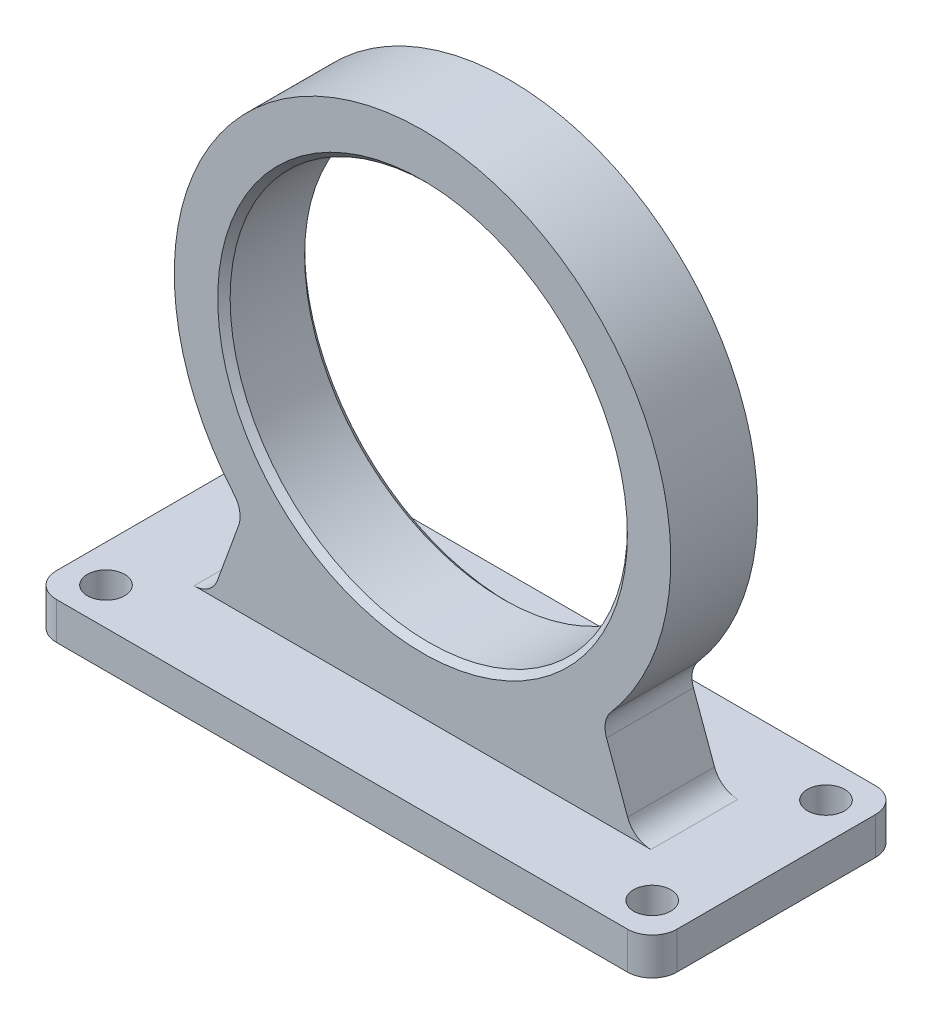
ISO-10303-21;
HEADER;
FILE_DESCRIPTION(('STEP AP214'),'2;1');
FILE_NAME('part.step','',(''),(''),'','','');
FILE_SCHEMA(('AUTOMOTIVE_DESIGN { 1 0 10303 214 1 1 1 1 }'));
ENDSEC;
DATA;
#1=APPLICATION_CONTEXT('core data for automotive mechanical design processes');
#2=APPLICATION_PROTOCOL_DEFINITION('international standard','automotive_design',2000,#1);
#3=PRODUCT_CONTEXT('',#1,'mechanical');
#4=PRODUCT('Part','Part','',(#3));
#5=PRODUCT_RELATED_PRODUCT_CATEGORY('part','',(#4));
#6=PRODUCT_DEFINITION_FORMATION('','',#4);
#7=PRODUCT_DEFINITION_CONTEXT('part definition',#1,'design');
#8=PRODUCT_DEFINITION('design','',#6,#7);
#9=PRODUCT_DEFINITION_SHAPE('','',#8);
#10=(LENGTH_UNIT() NAMED_UNIT(*) SI_UNIT(.MILLI.,.METRE.));
#11=(NAMED_UNIT(*) PLANE_ANGLE_UNIT() SI_UNIT($,.RADIAN.));
#12=(NAMED_UNIT(*) SI_UNIT($,.STERADIAN.) SOLID_ANGLE_UNIT());
#13=UNCERTAINTY_MEASURE_WITH_UNIT(LENGTH_MEASURE(1.E-05),#10,'distance_accuracy_value','');
#14=(GEOMETRIC_REPRESENTATION_CONTEXT(3) GLOBAL_UNCERTAINTY_ASSIGNED_CONTEXT((#13)) GLOBAL_UNIT_ASSIGNED_CONTEXT((#10,
#11,#12)) REPRESENTATION_CONTEXT('',''));
#15=CARTESIAN_POINT('',(0.,0.,0.));
#16=DIRECTION('',(0.,0.,1.));
#17=DIRECTION('',(1.,0.,0.));
#18=AXIS2_PLACEMENT_3D('',#15,#16,#17);
#19=CARTESIAN_POINT('',(0.,0.,-3.5));
#20=DIRECTION('',(0.,0.,1.));
#21=DIRECTION('',(1.,0.,0.));
#22=AXIS2_PLACEMENT_3D('',#19,#20,#21);
#23=PLANE('',#22);
#24=CARTESIAN_POINT('',(0.,24.,-3.5));
#25=DIRECTION('',(0.,0.,1.));
#26=DIRECTION('',(1.,0.,0.));
#27=AXIS2_PLACEMENT_3D('',#24,#25,#26);
#28=CIRCLE('',#27,16.5);
#29=CARTESIAN_POINT('',(16.5,24.,-3.5));
#30=VERTEX_POINT('',#29);
#31=EDGE_CURVE('E11',#30,#30,#28,.T.);
#32=ORIENTED_EDGE('',*,*,#31,.T.);
#33=EDGE_LOOP('',(#32));
#34=FACE_BOUND('',#33,.T.);
#35=DIRECTION('',(1.,0.,0.));
#36=VECTOR('',#35,1.);
#37=CARTESIAN_POINT('',(0.,3.,-3.5));
#38=LINE('',#37,#36);
#39=CARTESIAN_POINT('',(-18.4004150764194,3.,-3.5));
#40=VERTEX_POINT('',#39);
#41=CARTESIAN_POINT('',(18.4004150764194,3.,-3.5));
#42=VERTEX_POINT('',#41);
#43=EDGE_CURVE('E163',#40,#42,#38,.T.);
#44=ORIENTED_EDGE('',*,*,#43,.F.);
#45=CARTESIAN_POINT('',(-18.4004150764194,5.,-3.5));
#46=DIRECTION('',(0.,0.,1.));
#47=DIRECTION('',(1.,0.,0.));
#48=AXIS2_PLACEMENT_3D('',#45,#46,#47);
#49=CIRCLE('',#48,2.);
#50=CARTESIAN_POINT('',(-16.5210298348476,4.31595971334865,-3.5));
#51=VERTEX_POINT('',#50);
#52=EDGE_CURVE('E253',#40,#51,#49,.T.);
#53=ORIENTED_EDGE('',*,*,#52,.T.);
#54=DIRECTION('',(-0.342020143325673,-0.939692620785907,0.));
#55=VECTOR('',#54,1.);
#56=CARTESIAN_POINT('',(-15.9755591810411,5.81462801765719,-3.5));
#57=LINE('',#56,#55);
#58=CARTESIAN_POINT('',(-14.8189573638303,8.99236539374394,-3.5));
#59=VERTEX_POINT('',#58);
#60=EDGE_CURVE('E296',#59,#51,#57,.T.);
#61=ORIENTED_EDGE('',*,*,#60,.F.);
#62=CARTESIAN_POINT('',(-16.6983426054021,9.67640568039528,-3.5));
#63=DIRECTION('',(0.,0.,1.));
#64=DIRECTION('',(1.,0.,0.));
#65=AXIS2_PLACEMENT_3D('',#62,#63,#64);
#66=CIRCLE('',#65,2.);
#67=CARTESIAN_POINT('',(-15.1803114594565,10.9785506185412,-3.5));
#68=VERTEX_POINT('',#67);
#69=EDGE_CURVE('E278',#59,#68,#66,.T.);
#70=ORIENTED_EDGE('',*,*,#69,.T.);
#71=CARTESIAN_POINT('',(0.,24.,-3.5));
#72=DIRECTION('',(0.,0.,1.));
#73=DIRECTION('',(1.,0.,0.));
#74=AXIS2_PLACEMENT_3D('',#71,#72,#73);
#75=CIRCLE('',#74,20.);
#76=CARTESIAN_POINT('',(15.1803114594565,10.9785506185412,-3.5));
#77=VERTEX_POINT('',#76);
#78=EDGE_CURVE('E295',#77,#68,#75,.T.);
#79=ORIENTED_EDGE('',*,*,#78,.F.);
#80=CARTESIAN_POINT('',(16.6983426054021,9.67640568039527,-3.5));
#81=DIRECTION('',(0.,0.,1.));
#82=DIRECTION('',(1.,0.,0.));
#83=AXIS2_PLACEMENT_3D('',#80,#81,#82);
#84=CIRCLE('',#83,2.);
#85=CARTESIAN_POINT('',(14.8189573638303,8.99236539374393,-3.5));
#86=VERTEX_POINT('',#85);
#87=EDGE_CURVE('E177',#77,#86,#84,.T.);
#88=ORIENTED_EDGE('',*,*,#87,.T.);
#89=DIRECTION('',(0.342020143325673,-0.939692620785907,0.));
#90=VECTOR('',#89,1.);
#91=CARTESIAN_POINT('',(15.9755591810411,5.8146280176572,-3.5));
#92=LINE('',#91,#90);
#93=CARTESIAN_POINT('',(16.5210298348476,4.31595971334865,-3.5));
#94=VERTEX_POINT('',#93);
#95=EDGE_CURVE('E301',#86,#94,#92,.T.);
#96=ORIENTED_EDGE('',*,*,#95,.T.);
#97=CARTESIAN_POINT('',(18.4004150764194,5.,-3.5));
#98=DIRECTION('',(0.,0.,1.));
#99=DIRECTION('',(1.,0.,0.));
#100=AXIS2_PLACEMENT_3D('',#97,#98,#99);
#101=CIRCLE('',#100,2.);
#102=EDGE_CURVE('E178',#94,#42,#101,.T.);
#103=ORIENTED_EDGE('',*,*,#102,.T.);
#104=EDGE_LOOP('',(#44,#53,#61,#70,#79,#88,#96,#103));
#105=FACE_BOUND('',#104,.T.);
#106=ADVANCED_FACE('F36',(#34,#105),#23,.F.);
#107=CARTESIAN_POINT('',(0.,24.,3.5));
#108=DIRECTION('',(0.,0.,-1.));
#109=DIRECTION('',(-1.,0.,0.));
#110=AXIS2_PLACEMENT_3D('',#107,#108,#109);
#111=CYLINDRICAL_SURFACE('',#110,20.);
#112=ORIENTED_EDGE('',*,*,#78,.T.);
#113=DIRECTION('',(0.,0.,-1.));
#114=VECTOR('',#113,1.);
#115=CARTESIAN_POINT('',(-15.1803114594565,10.9785506185412,3.5));
#116=LINE('',#115,#114);
#117=CARTESIAN_POINT('',(-15.1803114594565,10.9785506185412,3.5));
#118=VERTEX_POINT('',#117);
#119=EDGE_CURVE('E272',#68,#118,#116,.F.);
#120=ORIENTED_EDGE('',*,*,#119,.T.);
#121=CARTESIAN_POINT('',(0.,24.,3.5));
#122=DIRECTION('',(0.,0.,1.));
#123=DIRECTION('',(1.,0.,0.));
#124=AXIS2_PLACEMENT_3D('',#121,#122,#123);
#125=CIRCLE('',#124,20.);
#126=CARTESIAN_POINT('',(15.1803114594565,10.9785506185412,3.5));
#127=VERTEX_POINT('',#126);
#128=EDGE_CURVE('E284',#127,#118,#125,.T.);
#129=ORIENTED_EDGE('',*,*,#128,.F.);
#130=DIRECTION('',(0.,0.,-1.));
#131=VECTOR('',#130,1.);
#132=CARTESIAN_POINT('',(15.1803114594565,10.9785506185412,3.5));
#133=LINE('',#132,#131);
#134=EDGE_CURVE('E269',#127,#77,#133,.T.);
#135=ORIENTED_EDGE('',*,*,#134,.T.);
#136=EDGE_LOOP('',(#112,#120,#129,#135));
#137=FACE_BOUND('',#136,.T.);
#138=ADVANCED_FACE('F249',(#137),#111,.T.);
#139=CARTESIAN_POINT('',(-15.9755591810411,5.81462801765719,3.5));
#140=DIRECTION('',(0.939692620785907,-0.342020143325673,0.));
#141=DIRECTION('',(0.342020143325673,0.939692620785907,0.));
#142=AXIS2_PLACEMENT_3D('',#139,#140,#141);
#143=PLANE('',#142);
#144=ORIENTED_EDGE('',*,*,#60,.T.);
#145=DIRECTION('',(0.,0.,-1.));
#146=VECTOR('',#145,1.);
#147=CARTESIAN_POINT('',(-16.5210298348476,4.31595971334865,3.5));
#148=LINE('',#147,#146);
#149=CARTESIAN_POINT('',(-16.5210298348476,4.31595971334865,3.5));
#150=VERTEX_POINT('',#149);
#151=EDGE_CURVE('E260',#51,#150,#148,.F.);
#152=ORIENTED_EDGE('',*,*,#151,.T.);
#153=DIRECTION('',(-0.342020143325673,-0.939692620785907,0.));
#154=VECTOR('',#153,1.);
#155=CARTESIAN_POINT('',(-15.9755591810411,5.81462801765719,3.5));
#156=LINE('',#155,#154);
#157=CARTESIAN_POINT('',(-14.8189573638303,8.99236539374394,3.5));
#158=VERTEX_POINT('',#157);
#159=EDGE_CURVE('E282',#158,#150,#156,.T.);
#160=ORIENTED_EDGE('',*,*,#159,.F.);
#161=DIRECTION('',(0.,0.,1.));
#162=VECTOR('',#161,1.);
#163=CARTESIAN_POINT('',(-14.8189573638303,8.99236539374394,-3.5));
#164=LINE('',#163,#162);
#165=EDGE_CURVE('E262',#158,#59,#164,.F.);
#166=ORIENTED_EDGE('',*,*,#165,.T.);
#167=EDGE_LOOP('',(#144,#152,#160,#166));
#168=FACE_BOUND('',#167,.T.);
#169=ADVANCED_FACE('F289',(#168),#143,.F.);
#170=CARTESIAN_POINT('',(-25.,0.,3.5));
#171=DIRECTION('',(1.,0.,0.));
#172=DIRECTION('',(0.,0.,-1.));
#173=AXIS2_PLACEMENT_3D('',#170,#171,#172);
#174=PLANE('',#173);
#175=DIRECTION('',(0.,0.,-1.));
#176=VECTOR('',#175,1.);
#177=CARTESIAN_POINT('',(-25.,3.,3.5));
#178=LINE('',#177,#176);
#179=CARTESIAN_POINT('',(-25.,3.,8.));
#180=VERTEX_POINT('',#179);
#181=CARTESIAN_POINT('',(-25.,3.,-8.));
#182=VERTEX_POINT('',#181);
#183=EDGE_CURVE('E164',#180,#182,#178,.T.);
#184=ORIENTED_EDGE('',*,*,#183,.T.);
#185=DIRECTION('',(0.,-1.,0.));
#186=VECTOR('',#185,1.);
#187=CARTESIAN_POINT('',(-25.,0.,-8.));
#188=LINE('',#187,#186);
#189=CARTESIAN_POINT('',(-25.,0.,-8.));
#190=VERTEX_POINT('',#189);
#191=EDGE_CURVE('E189',#182,#190,#188,.T.);
#192=ORIENTED_EDGE('',*,*,#191,.T.);
#193=DIRECTION('',(0.,0.,-1.));
#194=VECTOR('',#193,1.);
#195=CARTESIAN_POINT('',(-25.,0.,3.5));
#196=LINE('',#195,#194);
#197=CARTESIAN_POINT('',(-25.,0.,8.));
#198=VERTEX_POINT('',#197);
#199=EDGE_CURVE('E315',#198,#190,#196,.T.);
#200=ORIENTED_EDGE('',*,*,#199,.F.);
#201=DIRECTION('',(0.,-1.,0.));
#202=VECTOR('',#201,1.);
#203=CARTESIAN_POINT('',(-25.,0.,8.));
#204=LINE('',#203,#202);
#205=EDGE_CURVE('E187',#198,#180,#204,.F.);
#206=ORIENTED_EDGE('',*,*,#205,.T.);
#207=EDGE_LOOP('',(#184,#192,#200,#206));
#208=FACE_BOUND('',#207,.T.);
#209=ADVANCED_FACE('F320',(#208),#174,.F.);
#210=CARTESIAN_POINT('',(0.,0.,3.5));
#211=DIRECTION('',(0.,1.,0.));
#212=DIRECTION('',(0.,0.,1.));
#213=AXIS2_PLACEMENT_3D('',#210,#211,#212);
#214=PLANE('',#213);
#215=ORIENTED_EDGE('',*,*,#199,.T.);
#216=CARTESIAN_POINT('',(-23.,0.,-8.));
#217=DIRECTION('',(0.,1.,0.));
#218=DIRECTION('',(0.,0.,1.));
#219=AXIS2_PLACEMENT_3D('',#216,#217,#218);
#220=CIRCLE('',#219,2.);
#221=CARTESIAN_POINT('',(-23.,0.,-10.));
#222=VERTEX_POINT('',#221);
#223=EDGE_CURVE('E198',#190,#222,#220,.F.);
#224=ORIENTED_EDGE('',*,*,#223,.T.);
#225=DIRECTION('',(1.,0.,0.));
#226=VECTOR('',#225,1.);
#227=CARTESIAN_POINT('',(0.,0.,-10.));
#228=LINE('',#227,#226);
#229=CARTESIAN_POINT('',(23.,0.,-10.));
#230=VERTEX_POINT('',#229);
#231=EDGE_CURVE('E332',#222,#230,#228,.T.);
#232=ORIENTED_EDGE('',*,*,#231,.T.);
#233=CARTESIAN_POINT('',(23.,0.,-8.));
#234=DIRECTION('',(0.,1.,0.));
#235=DIRECTION('',(0.,0.,1.));
#236=AXIS2_PLACEMENT_3D('',#233,#234,#235);
#237=CIRCLE('',#236,2.);
#238=CARTESIAN_POINT('',(25.,0.,-8.));
#239=VERTEX_POINT('',#238);
#240=EDGE_CURVE('E196',#230,#239,#237,.F.);
#241=ORIENTED_EDGE('',*,*,#240,.T.);
#242=DIRECTION('',(0.,0.,-1.));
#243=VECTOR('',#242,1.);
#244=CARTESIAN_POINT('',(25.,0.,3.5));
#245=LINE('',#244,#243);
#246=CARTESIAN_POINT('',(25.,0.,8.));
#247=VERTEX_POINT('',#246);
#248=EDGE_CURVE('E312',#247,#239,#245,.T.);
#249=ORIENTED_EDGE('',*,*,#248,.F.);
#250=CARTESIAN_POINT('',(23.,0.,8.));
#251=DIRECTION('',(0.,1.,0.));
#252=DIRECTION('',(0.,0.,1.));
#253=AXIS2_PLACEMENT_3D('',#250,#251,#252);
#254=CIRCLE('',#253,2.);
#255=CARTESIAN_POINT('',(23.,0.,10.));
#256=VERTEX_POINT('',#255);
#257=EDGE_CURVE('E194',#247,#256,#254,.F.);
#258=ORIENTED_EDGE('',*,*,#257,.T.);
#259=DIRECTION('',(1.,0.,0.));
#260=VECTOR('',#259,1.);
#261=CARTESIAN_POINT('',(0.,0.,10.));
#262=LINE('',#261,#260);
#263=CARTESIAN_POINT('',(-23.,0.,10.));
#264=VERTEX_POINT('',#263);
#265=EDGE_CURVE('E352',#264,#256,#262,.T.);
#266=ORIENTED_EDGE('',*,*,#265,.F.);
#267=CARTESIAN_POINT('',(-23.,0.,8.));
#268=DIRECTION('',(0.,1.,0.));
#269=DIRECTION('',(0.,0.,1.));
#270=AXIS2_PLACEMENT_3D('',#267,#268,#269);
#271=CIRCLE('',#270,2.);
#272=EDGE_CURVE('E192',#264,#198,#271,.F.);
#273=ORIENTED_EDGE('',*,*,#272,.T.);
#274=EDGE_LOOP('',(#215,#224,#232,#241,#249,#258,#266,#273));
#275=FACE_BOUND('',#274,.T.);
#276=CARTESIAN_POINT('',(21.9999999999999,0.,7.));
#277=DIRECTION('',(0.,-1.,0.));
#278=DIRECTION('',(0.,0.,-1.));
#279=AXIS2_PLACEMENT_3D('',#276,#277,#278);
#280=CIRCLE('',#279,1.5);
#281=CARTESIAN_POINT('',(21.9999999999999,0.,5.5));
#282=VERTEX_POINT('',#281);
#283=EDGE_CURVE('E356',#282,#282,#280,.T.);
#284=ORIENTED_EDGE('',*,*,#283,.F.);
#285=EDGE_LOOP('',(#284));
#286=FACE_BOUND('',#285,.T.);
#287=CARTESIAN_POINT('',(-22.,0.,7.));
#288=DIRECTION('',(0.,-1.,0.));
#289=DIRECTION('',(0.,0.,-1.));
#290=AXIS2_PLACEMENT_3D('',#287,#288,#289);
#291=CIRCLE('',#290,1.5);
#292=CARTESIAN_POINT('',(-22.,0.,5.5));
#293=VERTEX_POINT('',#292);
#294=EDGE_CURVE('E304',#293,#293,#291,.F.);
#295=ORIENTED_EDGE('',*,*,#294,.T.);
#296=EDGE_LOOP('',(#295));
#297=FACE_BOUND('',#296,.T.);
#298=CARTESIAN_POINT('',(-22.,0.,-7.));
#299=DIRECTION('',(0.,-1.,0.));
#300=DIRECTION('',(0.,0.,-1.));
#301=AXIS2_PLACEMENT_3D('',#298,#299,#300);
#302=CIRCLE('',#301,1.5);
#303=CARTESIAN_POINT('',(-22.,0.,-8.5));
#304=VERTEX_POINT('',#303);
#305=EDGE_CURVE('E339',#304,#304,#302,.T.);
#306=ORIENTED_EDGE('',*,*,#305,.F.);
#307=EDGE_LOOP('',(#306));
#308=FACE_BOUND('',#307,.T.);
#309=CARTESIAN_POINT('',(22.,0.,-7.));
#310=DIRECTION('',(0.,-1.,0.));
#311=DIRECTION('',(0.,0.,-1.));
#312=AXIS2_PLACEMENT_3D('',#309,#310,#311);
#313=CIRCLE('',#312,1.5);
#314=CARTESIAN_POINT('',(22.,0.,-8.5));
#315=VERTEX_POINT('',#314);
#316=EDGE_CURVE('E344',#315,#315,#313,.F.);
#317=ORIENTED_EDGE('',*,*,#316,.T.);
#318=EDGE_LOOP('',(#317));
#319=FACE_BOUND('',#318,.T.);
#320=ADVANCED_FACE('F330',(#275,#286,#297,#308,#319),#214,.F.);
#321=CARTESIAN_POINT('',(25.,0.,3.5));
#322=DIRECTION('',(1.,0.,0.));
#323=DIRECTION('',(0.,0.,-1.));
#324=AXIS2_PLACEMENT_3D('',#321,#322,#323);
#325=PLANE('',#324);
#326=ORIENTED_EDGE('',*,*,#248,.T.);
#327=DIRECTION('',(0.,-1.,0.));
#328=VECTOR('',#327,1.);
#329=CARTESIAN_POINT('',(25.,0.,-8.));
#330=LINE('',#329,#328);
#331=CARTESIAN_POINT('',(25.,3.,-8.));
#332=VERTEX_POINT('',#331);
#333=EDGE_CURVE('E215',#239,#332,#330,.F.);
#334=ORIENTED_EDGE('',*,*,#333,.T.);
#335=DIRECTION('',(0.,0.,-1.));
#336=VECTOR('',#335,1.);
#337=CARTESIAN_POINT('',(25.,3.,3.5));
#338=LINE('',#337,#336);
#339=CARTESIAN_POINT('',(25.,3.,8.));
#340=VERTEX_POINT('',#339);
#341=EDGE_CURVE('E309',#340,#332,#338,.T.);
#342=ORIENTED_EDGE('',*,*,#341,.F.);
#343=DIRECTION('',(0.,-1.,0.));
#344=VECTOR('',#343,1.);
#345=CARTESIAN_POINT('',(25.,0.,8.));
#346=LINE('',#345,#344);
#347=EDGE_CURVE('E212',#340,#247,#346,.T.);
#348=ORIENTED_EDGE('',*,*,#347,.T.);
#349=EDGE_LOOP('',(#326,#334,#342,#348));
#350=FACE_BOUND('',#349,.T.);
#351=ADVANCED_FACE('F403',(#350),#325,.T.);
#352=CARTESIAN_POINT('',(0.,3.,3.5));
#353=DIRECTION('',(0.,1.,0.));
#354=DIRECTION('',(0.,0.,1.));
#355=AXIS2_PLACEMENT_3D('',#352,#353,#354);
#356=PLANE('',#355);
#357=DIRECTION('',(0.,0.,-1.));
#358=VECTOR('',#357,1.);
#359=CARTESIAN_POINT('',(-18.4004150764194,3.,3.5));
#360=LINE('',#359,#358);
#361=CARTESIAN_POINT('',(-18.4004150764194,3.,3.5));
#362=VERTEX_POINT('',#361);
#363=EDGE_CURVE('E171',#362,#40,#360,.T.);
#364=ORIENTED_EDGE('',*,*,#363,.T.);
#365=ORIENTED_EDGE('',*,*,#43,.T.);
#366=DIRECTION('',(0.,0.,-1.));
#367=VECTOR('',#366,1.);
#368=CARTESIAN_POINT('',(18.4004150764194,3.,3.5));
#369=LINE('',#368,#367);
#370=CARTESIAN_POINT('',(18.4004150764194,3.,3.5));
#371=VERTEX_POINT('',#370);
#372=EDGE_CURVE('E167',#42,#371,#369,.F.);
#373=ORIENTED_EDGE('',*,*,#372,.T.);
#374=DIRECTION('',(-1.,0.,0.));
#375=VECTOR('',#374,1.);
#376=CARTESIAN_POINT('',(0.,3.,3.5));
#377=LINE('',#376,#375);
#378=EDGE_CURVE('E150',#371,#362,#377,.T.);
#379=ORIENTED_EDGE('',*,*,#378,.T.);
#380=EDGE_LOOP('',(#364,#365,#373,#379));
#381=FACE_BOUND('',#380,.T.);
#382=DIRECTION('',(1.,0.,0.));
#383=VECTOR('',#382,1.);
#384=CARTESIAN_POINT('',(0.,3.,-10.));
#385=LINE('',#384,#383);
#386=CARTESIAN_POINT('',(-23.,3.,-10.));
#387=VERTEX_POINT('',#386);
#388=CARTESIAN_POINT('',(23.,3.,-10.));
#389=VERTEX_POINT('',#388);
#390=EDGE_CURVE('E338',#387,#389,#385,.T.);
#391=ORIENTED_EDGE('',*,*,#390,.F.);
#392=CARTESIAN_POINT('',(-23.,3.,-8.));
#393=DIRECTION('',(0.,1.,0.));
#394=DIRECTION('',(0.,0.,1.));
#395=AXIS2_PLACEMENT_3D('',#392,#393,#394);
#396=CIRCLE('',#395,2.);
#397=EDGE_CURVE('E210',#387,#182,#396,.T.);
#398=ORIENTED_EDGE('',*,*,#397,.T.);
#399=ORIENTED_EDGE('',*,*,#183,.F.);
#400=CARTESIAN_POINT('',(-23.,3.,8.));
#401=DIRECTION('',(0.,1.,0.));
#402=DIRECTION('',(0.,0.,1.));
#403=AXIS2_PLACEMENT_3D('',#400,#401,#402);
#404=CIRCLE('',#403,2.);
#405=CARTESIAN_POINT('',(-23.,3.,10.));
#406=VERTEX_POINT('',#405);
#407=EDGE_CURVE('E58',#180,#406,#404,.T.);
#408=ORIENTED_EDGE('',*,*,#407,.T.);
#409=DIRECTION('',(1.,0.,0.));
#410=VECTOR('',#409,1.);
#411=CARTESIAN_POINT('',(0.,3.,10.));
#412=LINE('',#411,#410);
#413=CARTESIAN_POINT('',(23.,3.,10.));
#414=VERTEX_POINT('',#413);
#415=EDGE_CURVE('E351',#406,#414,#412,.T.);
#416=ORIENTED_EDGE('',*,*,#415,.T.);
#417=CARTESIAN_POINT('',(23.,3.,8.));
#418=DIRECTION('',(0.,1.,0.));
#419=DIRECTION('',(0.,0.,1.));
#420=AXIS2_PLACEMENT_3D('',#417,#418,#419);
#421=CIRCLE('',#420,2.);
#422=EDGE_CURVE('E206',#414,#340,#421,.T.);
#423=ORIENTED_EDGE('',*,*,#422,.T.);
#424=ORIENTED_EDGE('',*,*,#341,.T.);
#425=CARTESIAN_POINT('',(23.,3.,-8.));
#426=DIRECTION('',(0.,1.,0.));
#427=DIRECTION('',(0.,0.,1.));
#428=AXIS2_PLACEMENT_3D('',#425,#426,#427);
#429=CIRCLE('',#428,2.);
#430=EDGE_CURVE('E208',#332,#389,#429,.T.);
#431=ORIENTED_EDGE('',*,*,#430,.T.);
#432=EDGE_LOOP('',(#391,#398,#399,#408,#416,#423,#424,#431));
#433=FACE_BOUND('',#432,.T.);
#434=CARTESIAN_POINT('',(-22.,3.,7.));
#435=DIRECTION('',(0.,1.,0.));
#436=DIRECTION('',(0.,0.,1.));
#437=AXIS2_PLACEMENT_3D('',#434,#435,#436);
#438=CIRCLE('',#437,1.5);
#439=CARTESIAN_POINT('',(-22.,3.,8.5));
#440=VERTEX_POINT('',#439);
#441=EDGE_CURVE('E353',#440,#440,#438,.T.);
#442=ORIENTED_EDGE('',*,*,#441,.F.);
#443=EDGE_LOOP('',(#442));
#444=FACE_BOUND('',#443,.T.);
#445=CARTESIAN_POINT('',(21.9999999999999,3.,7.));
#446=DIRECTION('',(0.,1.,0.));
#447=DIRECTION('',(0.,0.,1.));
#448=AXIS2_PLACEMENT_3D('',#445,#446,#447);
#449=CIRCLE('',#448,1.5);
#450=CARTESIAN_POINT('',(21.9999999999999,3.,8.5));
#451=VERTEX_POINT('',#450);
#452=EDGE_CURVE('E299',#451,#451,#449,.F.);
#453=ORIENTED_EDGE('',*,*,#452,.T.);
#454=EDGE_LOOP('',(#453));
#455=FACE_BOUND('',#454,.T.);
#456=CARTESIAN_POINT('',(22.,3.,-7.));
#457=DIRECTION('',(0.,1.,0.));
#458=DIRECTION('',(0.,0.,1.));
#459=AXIS2_PLACEMENT_3D('',#456,#457,#458);
#460=CIRCLE('',#459,1.5);
#461=CARTESIAN_POINT('',(22.,3.,-5.5));
#462=VERTEX_POINT('',#461);
#463=EDGE_CURVE('E341',#462,#462,#460,.T.);
#464=ORIENTED_EDGE('',*,*,#463,.F.);
#465=EDGE_LOOP('',(#464));
#466=FACE_BOUND('',#465,.T.);
#467=CARTESIAN_POINT('',(-22.,3.,-7.));
#468=DIRECTION('',(0.,1.,0.));
#469=DIRECTION('',(0.,0.,1.));
#470=AXIS2_PLACEMENT_3D('',#467,#468,#469);
#471=CIRCLE('',#470,1.5);
#472=CARTESIAN_POINT('',(-22.,3.,-5.5));
#473=VERTEX_POINT('',#472);
#474=EDGE_CURVE('E348',#473,#473,#471,.F.);
#475=ORIENTED_EDGE('',*,*,#474,.T.);
#476=EDGE_LOOP('',(#475));
#477=FACE_BOUND('',#476,.T.);
#478=ADVANCED_FACE('F168',(#381,#433,#444,#455,#466,#477),#356,.T.);
#479=CARTESIAN_POINT('',(0.,24.,3.5));
#480=DIRECTION('',(0.,0.,-1.));
#481=DIRECTION('',(-1.,0.,0.));
#482=AXIS2_PLACEMENT_3D('',#479,#480,#481);
#483=CYLINDRICAL_SURFACE('',#482,16.);
#484=CARTESIAN_POINT('',(0.,24.,3.00000000000001));
#485=DIRECTION('',(0.,0.,1.));
#486=DIRECTION('',(1.,0.,0.));
#487=AXIS2_PLACEMENT_3D('',#484,#485,#486);
#488=CIRCLE('',#487,16.);
#489=CARTESIAN_POINT('',(16.,24.,3.00000000000001));
#490=VERTEX_POINT('',#489);
#491=EDGE_CURVE('E224',#490,#490,#488,.T.);
#492=ORIENTED_EDGE('',*,*,#491,.T.);
#493=EDGE_LOOP('',(#492));
#494=FACE_BOUND('',#493,.T.);
#495=CARTESIAN_POINT('',(0.,24.,-3.00000000000001));
#496=DIRECTION('',(0.,0.,1.));
#497=DIRECTION('',(1.,0.,0.));
#498=AXIS2_PLACEMENT_3D('',#495,#496,#497);
#499=CIRCLE('',#498,16.);
#500=CARTESIAN_POINT('',(16.,24.,-3.00000000000001));
#501=VERTEX_POINT('',#500);
#502=EDGE_CURVE('E221',#501,#501,#499,.F.);
#503=ORIENTED_EDGE('',*,*,#502,.T.);
#504=EDGE_LOOP('',(#503));
#505=FACE_BOUND('',#504,.T.);
#506=ADVANCED_FACE('F236',(#494,#505),#483,.F.);
#507=CARTESIAN_POINT('',(15.9755591810411,5.8146280176572,3.5));
#508=DIRECTION('',(0.939692620785907,0.342020143325673,0.));
#509=DIRECTION('',(-0.342020143325673,0.939692620785907,0.));
#510=AXIS2_PLACEMENT_3D('',#507,#508,#509);
#511=PLANE('',#510);
#512=DIRECTION('',(0.342020143325673,-0.939692620785907,0.));
#513=VECTOR('',#512,1.);
#514=CARTESIAN_POINT('',(15.9755591810411,5.8146280176572,3.5));
#515=LINE('',#514,#513);
#516=CARTESIAN_POINT('',(14.8189573638303,8.99236539374393,3.5));
#517=VERTEX_POINT('',#516);
#518=CARTESIAN_POINT('',(16.5210298348476,4.31595971334865,3.5));
#519=VERTEX_POINT('',#518);
#520=EDGE_CURVE('E290',#517,#519,#515,.T.);
#521=ORIENTED_EDGE('',*,*,#520,.T.);
#522=DIRECTION('',(0.,0.,-1.));
#523=VECTOR('',#522,1.);
#524=CARTESIAN_POINT('',(16.5210298348476,4.31595971334865,-3.5));
#525=LINE('',#524,#523);
#526=EDGE_CURVE('E176',#519,#94,#525,.T.);
#527=ORIENTED_EDGE('',*,*,#526,.T.);
#528=ORIENTED_EDGE('',*,*,#95,.F.);
#529=DIRECTION('',(0.,0.,-1.));
#530=VECTOR('',#529,1.);
#531=CARTESIAN_POINT('',(14.8189573638303,8.99236539374393,3.5));
#532=LINE('',#531,#530);
#533=EDGE_CURVE('E274',#86,#517,#532,.F.);
#534=ORIENTED_EDGE('',*,*,#533,.T.);
#535=EDGE_LOOP('',(#521,#527,#528,#534));
#536=FACE_BOUND('',#535,.T.);
#537=ADVANCED_FACE('F239',(#536),#511,.T.);
#538=CARTESIAN_POINT('',(0.,0.,3.5));
#539=DIRECTION('',(0.,0.,1.));
#540=DIRECTION('',(1.,0.,0.));
#541=AXIS2_PLACEMENT_3D('',#538,#539,#540);
#542=PLANE('',#541);
#543=CARTESIAN_POINT('',(0.,24.,3.5));
#544=DIRECTION('',(0.,0.,1.));
#545=DIRECTION('',(1.,0.,0.));
#546=AXIS2_PLACEMENT_3D('',#543,#544,#545);
#547=CIRCLE('',#546,16.5);
#548=CARTESIAN_POINT('',(16.5,24.,3.5));
#549=VERTEX_POINT('',#548);
#550=EDGE_CURVE('E44',#549,#549,#547,.F.);
#551=ORIENTED_EDGE('',*,*,#550,.T.);
#552=EDGE_LOOP('',(#551));
#553=FACE_BOUND('',#552,.T.);
#554=ORIENTED_EDGE('',*,*,#378,.F.);
#555=CARTESIAN_POINT('',(18.4004150764194,5.,3.5));
#556=DIRECTION('',(0.,0.,1.));
#557=DIRECTION('',(1.,0.,0.));
#558=AXIS2_PLACEMENT_3D('',#555,#556,#557);
#559=CIRCLE('',#558,2.);
#560=EDGE_CURVE('E155',#371,#519,#559,.F.);
#561=ORIENTED_EDGE('',*,*,#560,.T.);
#562=ORIENTED_EDGE('',*,*,#520,.F.);
#563=CARTESIAN_POINT('',(16.6983426054021,9.67640568039527,3.5));
#564=DIRECTION('',(0.,0.,1.));
#565=DIRECTION('',(1.,0.,0.));
#566=AXIS2_PLACEMENT_3D('',#563,#564,#565);
#567=CIRCLE('',#566,2.);
#568=EDGE_CURVE('E180',#517,#127,#567,.F.);
#569=ORIENTED_EDGE('',*,*,#568,.T.);
#570=ORIENTED_EDGE('',*,*,#128,.T.);
#571=CARTESIAN_POINT('',(-16.6983426054021,9.67640568039528,3.5));
#572=DIRECTION('',(0.,0.,1.));
#573=DIRECTION('',(1.,0.,0.));
#574=AXIS2_PLACEMENT_3D('',#571,#572,#573);
#575=CIRCLE('',#574,2.);
#576=EDGE_CURVE('E182',#118,#158,#575,.F.);
#577=ORIENTED_EDGE('',*,*,#576,.T.);
#578=ORIENTED_EDGE('',*,*,#159,.T.);
#579=CARTESIAN_POINT('',(-18.4004150764194,5.,3.5));
#580=DIRECTION('',(0.,0.,1.));
#581=DIRECTION('',(1.,0.,0.));
#582=AXIS2_PLACEMENT_3D('',#579,#580,#581);
#583=CIRCLE('',#582,2.);
#584=EDGE_CURVE('E159',#150,#362,#583,.F.);
#585=ORIENTED_EDGE('',*,*,#584,.T.);
#586=EDGE_LOOP('',(#554,#561,#562,#569,#570,#577,#578,#585));
#587=FACE_BOUND('',#586,.T.);
#588=ADVANCED_FACE('F152',(#553,#587),#542,.T.);
#589=CARTESIAN_POINT('',(21.9999999999999,53.4207298638169,7.));
#590=DIRECTION('',(0.,-1.,0.));
#591=DIRECTION('',(0.,0.,-1.));
#592=AXIS2_PLACEMENT_3D('',#589,#590,#591);
#593=CYLINDRICAL_SURFACE('',#592,1.5);
#594=ORIENTED_EDGE('',*,*,#283,.T.);
#595=EDGE_LOOP('',(#594));
#596=FACE_BOUND('',#595,.T.);
#597=ORIENTED_EDGE('',*,*,#452,.F.);
#598=EDGE_LOOP('',(#597));
#599=FACE_BOUND('',#598,.T.);
#600=ADVANCED_FACE('F390',(#596,#599),#593,.F.);
#601=CARTESIAN_POINT('',(0.,53.4207298638169,10.));
#602=DIRECTION('',(0.,0.,-1.));
#603=DIRECTION('',(-1.,0.,0.));
#604=AXIS2_PLACEMENT_3D('',#601,#602,#603);
#605=PLANE('',#604);
#606=ORIENTED_EDGE('',*,*,#265,.T.);
#607=DIRECTION('',(0.,-1.,0.));
#608=VECTOR('',#607,1.);
#609=CARTESIAN_POINT('',(23.,3.,10.));
#610=LINE('',#609,#608);
#611=EDGE_CURVE('E51',#256,#414,#610,.F.);
#612=ORIENTED_EDGE('',*,*,#611,.T.);
#613=ORIENTED_EDGE('',*,*,#415,.F.);
#614=DIRECTION('',(0.,-1.,0.));
#615=VECTOR('',#614,1.);
#616=CARTESIAN_POINT('',(-23.,53.4207298638169,10.));
#617=LINE('',#616,#615);
#618=EDGE_CURVE('E217',#406,#264,#617,.T.);
#619=ORIENTED_EDGE('',*,*,#618,.T.);
#620=EDGE_LOOP('',(#606,#612,#613,#619));
#621=FACE_BOUND('',#620,.T.);
#622=ADVANCED_FACE('F388',(#621),#605,.F.);
#623=CARTESIAN_POINT('',(-22.,53.4207298638169,7.));
#624=DIRECTION('',(0.,-1.,0.));
#625=DIRECTION('',(0.,0.,-1.));
#626=AXIS2_PLACEMENT_3D('',#623,#624,#625);
#627=CYLINDRICAL_SURFACE('',#626,1.5);
#628=ORIENTED_EDGE('',*,*,#294,.F.);
#629=EDGE_LOOP('',(#628));
#630=FACE_BOUND('',#629,.T.);
#631=ORIENTED_EDGE('',*,*,#441,.T.);
#632=EDGE_LOOP('',(#631));
#633=FACE_BOUND('',#632,.T.);
#634=ADVANCED_FACE('F385',(#630,#633),#627,.F.);
#635=CARTESIAN_POINT('',(-22.,53.4207298638169,-7.));
#636=DIRECTION('',(0.,-1.,0.));
#637=DIRECTION('',(0.,0.,-1.));
#638=AXIS2_PLACEMENT_3D('',#635,#636,#637);
#639=CYLINDRICAL_SURFACE('',#638,1.5);
#640=ORIENTED_EDGE('',*,*,#305,.T.);
#641=EDGE_LOOP('',(#640));
#642=FACE_BOUND('',#641,.T.);
#643=ORIENTED_EDGE('',*,*,#474,.F.);
#644=EDGE_LOOP('',(#643));
#645=FACE_BOUND('',#644,.T.);
#646=ADVANCED_FACE('F381',(#642,#645),#639,.F.);
#647=CARTESIAN_POINT('',(0.,53.4207298638169,-10.));
#648=DIRECTION('',(0.,0.,-1.));
#649=DIRECTION('',(-1.,0.,0.));
#650=AXIS2_PLACEMENT_3D('',#647,#648,#649);
#651=PLANE('',#650);
#652=ORIENTED_EDGE('',*,*,#231,.F.);
#653=DIRECTION('',(0.,-1.,0.));
#654=VECTOR('',#653,1.);
#655=CARTESIAN_POINT('',(-23.,3.,-10.));
#656=LINE('',#655,#654);
#657=EDGE_CURVE('E203',#222,#387,#656,.F.);
#658=ORIENTED_EDGE('',*,*,#657,.T.);
#659=ORIENTED_EDGE('',*,*,#390,.T.);
#660=DIRECTION('',(0.,-1.,0.));
#661=VECTOR('',#660,1.);
#662=CARTESIAN_POINT('',(23.,53.4207298638169,-10.));
#663=LINE('',#662,#661);
#664=EDGE_CURVE('E200',#389,#230,#663,.T.);
#665=ORIENTED_EDGE('',*,*,#664,.T.);
#666=EDGE_LOOP('',(#652,#658,#659,#665));
#667=FACE_BOUND('',#666,.T.);
#668=ADVANCED_FACE('F334',(#667),#651,.T.);
#669=CARTESIAN_POINT('',(22.,53.4207298638169,-7.));
#670=DIRECTION('',(0.,-1.,0.));
#671=DIRECTION('',(0.,0.,-1.));
#672=AXIS2_PLACEMENT_3D('',#669,#670,#671);
#673=CYLINDRICAL_SURFACE('',#672,1.5);
#674=ORIENTED_EDGE('',*,*,#316,.F.);
#675=EDGE_LOOP('',(#674));
#676=FACE_BOUND('',#675,.T.);
#677=ORIENTED_EDGE('',*,*,#463,.T.);
#678=EDGE_LOOP('',(#677));
#679=FACE_BOUND('',#678,.T.);
#680=ADVANCED_FACE('F373',(#676,#679),#673,.F.);
#681=CARTESIAN_POINT('',(-18.4004150764194,5.,3.5));
#682=DIRECTION('',(0.,0.,-1.));
#683=DIRECTION('',(-1.,0.,0.));
#684=AXIS2_PLACEMENT_3D('',#681,#682,#683);
#685=CYLINDRICAL_SURFACE('',#684,2.);
#686=ORIENTED_EDGE('',*,*,#584,.F.);
#687=ORIENTED_EDGE('',*,*,#151,.F.);
#688=ORIENTED_EDGE('',*,*,#52,.F.);
#689=ORIENTED_EDGE('',*,*,#363,.F.);
#690=EDGE_LOOP('',(#686,#687,#688,#689));
#691=FACE_BOUND('',#690,.T.);
#692=ADVANCED_FACE('F259',(#691),#685,.F.);
#693=CARTESIAN_POINT('',(-16.6983426054021,9.67640568039528,3.5));
#694=DIRECTION('',(0.,0.,-1.));
#695=DIRECTION('',(-1.,0.,0.));
#696=AXIS2_PLACEMENT_3D('',#693,#694,#695);
#697=CYLINDRICAL_SURFACE('',#696,2.);
#698=ORIENTED_EDGE('',*,*,#576,.F.);
#699=ORIENTED_EDGE('',*,*,#119,.F.);
#700=ORIENTED_EDGE('',*,*,#69,.F.);
#701=ORIENTED_EDGE('',*,*,#165,.F.);
#702=EDGE_LOOP('',(#698,#699,#700,#701));
#703=FACE_BOUND('',#702,.T.);
#704=ADVANCED_FACE('F292',(#703),#697,.F.);
#705=CARTESIAN_POINT('',(18.4004150764194,5.,3.5));
#706=DIRECTION('',(0.,0.,1.));
#707=DIRECTION('',(1.,0.,0.));
#708=AXIS2_PLACEMENT_3D('',#705,#706,#707);
#709=CYLINDRICAL_SURFACE('',#708,2.);
#710=ORIENTED_EDGE('',*,*,#560,.F.);
#711=ORIENTED_EDGE('',*,*,#372,.F.);
#712=ORIENTED_EDGE('',*,*,#102,.F.);
#713=ORIENTED_EDGE('',*,*,#526,.F.);
#714=EDGE_LOOP('',(#710,#711,#712,#713));
#715=FACE_BOUND('',#714,.T.);
#716=ADVANCED_FACE('F174',(#715),#709,.F.);
#717=CARTESIAN_POINT('',(16.6983426054021,9.67640568039527,3.5));
#718=DIRECTION('',(0.,0.,-1.));
#719=DIRECTION('',(-1.,0.,0.));
#720=AXIS2_PLACEMENT_3D('',#717,#718,#719);
#721=CYLINDRICAL_SURFACE('',#720,2.);
#722=ORIENTED_EDGE('',*,*,#568,.F.);
#723=ORIENTED_EDGE('',*,*,#533,.F.);
#724=ORIENTED_EDGE('',*,*,#87,.F.);
#725=ORIENTED_EDGE('',*,*,#134,.F.);
#726=EDGE_LOOP('',(#722,#723,#724,#725));
#727=FACE_BOUND('',#726,.T.);
#728=ADVANCED_FACE('F419',(#727),#721,.F.);
#729=CARTESIAN_POINT('',(-23.,0.,-8.));
#730=DIRECTION('',(0.,1.,0.));
#731=DIRECTION('',(0.,0.,1.));
#732=AXIS2_PLACEMENT_3D('',#729,#730,#731);
#733=CYLINDRICAL_SURFACE('',#732,2.);
#734=ORIENTED_EDGE('',*,*,#397,.F.);
#735=ORIENTED_EDGE('',*,*,#657,.F.);
#736=ORIENTED_EDGE('',*,*,#223,.F.);
#737=ORIENTED_EDGE('',*,*,#191,.F.);
#738=EDGE_LOOP('',(#734,#735,#736,#737));
#739=FACE_BOUND('',#738,.T.);
#740=ADVANCED_FACE('F325',(#739),#733,.T.);
#741=CARTESIAN_POINT('',(23.,53.4207298638169,-8.));
#742=DIRECTION('',(0.,-1.,0.));
#743=DIRECTION('',(0.,0.,-1.));
#744=AXIS2_PLACEMENT_3D('',#741,#742,#743);
#745=CYLINDRICAL_SURFACE('',#744,2.);
#746=ORIENTED_EDGE('',*,*,#430,.F.);
#747=ORIENTED_EDGE('',*,*,#333,.F.);
#748=ORIENTED_EDGE('',*,*,#240,.F.);
#749=ORIENTED_EDGE('',*,*,#664,.F.);
#750=EDGE_LOOP('',(#746,#747,#748,#749));
#751=FACE_BOUND('',#750,.T.);
#752=ADVANCED_FACE('F425',(#751),#745,.T.);
#753=CARTESIAN_POINT('',(23.,0.,8.));
#754=DIRECTION('',(0.,1.,0.));
#755=DIRECTION('',(0.,0.,1.));
#756=AXIS2_PLACEMENT_3D('',#753,#754,#755);
#757=CYLINDRICAL_SURFACE('',#756,2.);
#758=ORIENTED_EDGE('',*,*,#422,.F.);
#759=ORIENTED_EDGE('',*,*,#611,.F.);
#760=ORIENTED_EDGE('',*,*,#257,.F.);
#761=ORIENTED_EDGE('',*,*,#347,.F.);
#762=EDGE_LOOP('',(#758,#759,#760,#761));
#763=FACE_BOUND('',#762,.T.);
#764=ADVANCED_FACE('F428',(#763),#757,.T.);
#765=CARTESIAN_POINT('',(-23.,53.4207298638169,8.));
#766=DIRECTION('',(0.,-1.,0.));
#767=DIRECTION('',(0.,0.,-1.));
#768=AXIS2_PLACEMENT_3D('',#765,#766,#767);
#769=CYLINDRICAL_SURFACE('',#768,2.);
#770=ORIENTED_EDGE('',*,*,#407,.F.);
#771=ORIENTED_EDGE('',*,*,#205,.F.);
#772=ORIENTED_EDGE('',*,*,#272,.F.);
#773=ORIENTED_EDGE('',*,*,#618,.F.);
#774=EDGE_LOOP('',(#770,#771,#772,#773));
#775=FACE_BOUND('',#774,.T.);
#776=ADVANCED_FACE('F233',(#775),#769,.T.);
#777=CARTESIAN_POINT('',(0.,24.,3.00000000000001));
#778=DIRECTION('',(0.,0.,1.));
#779=DIRECTION('',(1.,0.,0.));
#780=AXIS2_PLACEMENT_3D('',#777,#778,#779);
#781=CONICAL_SURFACE('',#780,16.,0.785398163397462);
#782=ORIENTED_EDGE('',*,*,#550,.F.);
#783=EDGE_LOOP('',(#782));
#784=FACE_BOUND('',#783,.T.);
#785=ORIENTED_EDGE('',*,*,#491,.F.);
#786=EDGE_LOOP('',(#785));
#787=FACE_BOUND('',#786,.T.);
#788=ADVANCED_FACE('F230',(#784,#787),#781,.F.);
#789=CARTESIAN_POINT('',(0.,24.,-3.5));
#790=DIRECTION('',(0.,0.,-1.));
#791=DIRECTION('',(-1.,0.,0.));
#792=AXIS2_PLACEMENT_3D('',#789,#790,#791);
#793=CONICAL_SURFACE('',#792,16.5,0.785398163397441);
#794=ORIENTED_EDGE('',*,*,#502,.F.);
#795=EDGE_LOOP('',(#794));
#796=FACE_BOUND('',#795,.T.);
#797=ORIENTED_EDGE('',*,*,#31,.F.);
#798=EDGE_LOOP('',(#797));
#799=FACE_BOUND('',#798,.T.);
#800=ADVANCED_FACE('F38',(#796,#799),#793,.F.);
#801=CLOSED_SHELL('',(#106,#138,#169,#209,#320,#351,#478,#506,#537,#588,#600,#622,#634,#646,
#668,#680,#692,#704,#716,#728,#740,#752,#764,#776,#788,#800));
#802=MANIFOLD_SOLID_BREP('B2',#801);
#803=ADVANCED_BREP_SHAPE_REPRESENTATION('',(#18,#802),#14);
#804=SHAPE_DEFINITION_REPRESENTATION(#9,#803);
ENDSEC;
END-ISO-10303-21;
